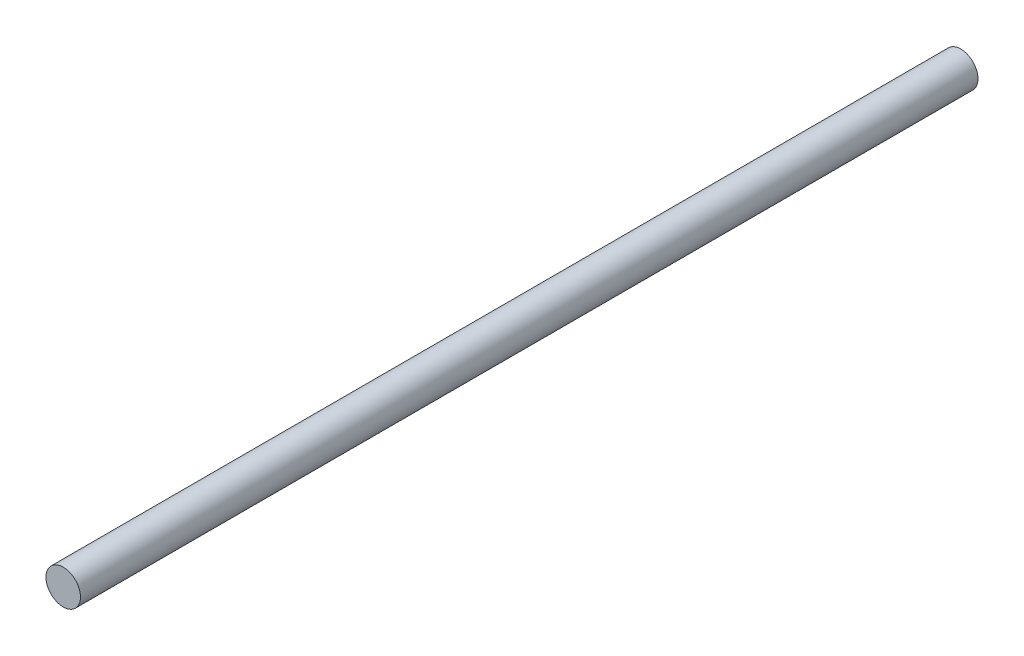
ISO-10303-21;
HEADER;
FILE_DESCRIPTION(('STEP AP214'),'2;1');
FILE_NAME('part.step','',(''),(''),'','','');
FILE_SCHEMA(('AUTOMOTIVE_DESIGN { 1 0 10303 214 1 1 1 1 }'));
ENDSEC;
DATA;
#1=APPLICATION_CONTEXT('core data for automotive mechanical design processes');
#2=APPLICATION_PROTOCOL_DEFINITION('international standard','automotive_design',2000,#1);
#3=PRODUCT_CONTEXT('',#1,'mechanical');
#4=PRODUCT('Part','Part','',(#3));
#5=PRODUCT_RELATED_PRODUCT_CATEGORY('part','',(#4));
#6=PRODUCT_DEFINITION_FORMATION('','',#4);
#7=PRODUCT_DEFINITION_CONTEXT('part definition',#1,'design');
#8=PRODUCT_DEFINITION('design','',#6,#7);
#9=PRODUCT_DEFINITION_SHAPE('','',#8);
#10=(LENGTH_UNIT() NAMED_UNIT(*) SI_UNIT(.MILLI.,.METRE.));
#11=(NAMED_UNIT(*) PLANE_ANGLE_UNIT() SI_UNIT($,.RADIAN.));
#12=(NAMED_UNIT(*) SI_UNIT($,.STERADIAN.) SOLID_ANGLE_UNIT());
#13=UNCERTAINTY_MEASURE_WITH_UNIT(LENGTH_MEASURE(1.E-05),#10,'distance_accuracy_value','');
#14=(GEOMETRIC_REPRESENTATION_CONTEXT(3) GLOBAL_UNCERTAINTY_ASSIGNED_CONTEXT((#13)) GLOBAL_UNIT_ASSIGNED_CONTEXT((#10,
#11,#12)) REPRESENTATION_CONTEXT('',''));
#15=CARTESIAN_POINT('',(0.,0.,0.));
#16=DIRECTION('',(0.,0.,1.));
#17=DIRECTION('',(1.,0.,0.));
#18=AXIS2_PLACEMENT_3D('',#15,#16,#17);
#19=CARTESIAN_POINT('',(0.,0.,247.65));
#20=DIRECTION('',(0.,0.,-1.));
#21=DIRECTION('',(-1.,0.,0.));
#22=AXIS2_PLACEMENT_3D('',#19,#20,#21);
#23=CYLINDRICAL_SURFACE('',#22,4.7625);
#24=CARTESIAN_POINT('',(0.,0.,247.65));
#25=DIRECTION('',(0.,0.,1.));
#26=DIRECTION('',(1.,0.,0.));
#27=AXIS2_PLACEMENT_3D('',#24,#25,#26);
#28=CIRCLE('',#27,4.7625);
#29=CARTESIAN_POINT('',(4.7625,0.,247.65));
#30=VERTEX_POINT('',#29);
#31=EDGE_CURVE('E10',#30,#30,#28,.T.);
#32=ORIENTED_EDGE('',*,*,#31,.F.);
#33=EDGE_LOOP('',(#32));
#34=FACE_BOUND('',#33,.T.);
#35=CARTESIAN_POINT('',(0.,0.,0.));
#36=DIRECTION('',(0.,0.,1.));
#37=DIRECTION('',(1.,0.,0.));
#38=AXIS2_PLACEMENT_3D('',#35,#36,#37);
#39=CIRCLE('',#38,4.7625);
#40=CARTESIAN_POINT('',(4.7625,0.,0.));
#41=VERTEX_POINT('',#40);
#42=EDGE_CURVE('E42',#41,#41,#39,.T.);
#43=ORIENTED_EDGE('',*,*,#42,.T.);
#44=EDGE_LOOP('',(#43));
#45=FACE_BOUND('',#44,.T.);
#46=ADVANCED_FACE('F39',(#34,#45),#23,.T.);
#47=CARTESIAN_POINT('',(0.,0.,247.65));
#48=DIRECTION('',(0.,0.,1.));
#49=DIRECTION('',(1.,0.,0.));
#50=AXIS2_PLACEMENT_3D('',#47,#48,#49);
#51=PLANE('',#50);
#52=ORIENTED_EDGE('',*,*,#31,.T.);
#53=EDGE_LOOP('',(#52));
#54=FACE_BOUND('',#53,.T.);
#55=ADVANCED_FACE('F56',(#54),#51,.T.);
#56=CARTESIAN_POINT('',(0.,0.,0.));
#57=DIRECTION('',(0.,0.,1.));
#58=DIRECTION('',(1.,0.,0.));
#59=AXIS2_PLACEMENT_3D('',#56,#57,#58);
#60=PLANE('',#59);
#61=ORIENTED_EDGE('',*,*,#42,.F.);
#62=EDGE_LOOP('',(#61));
#63=FACE_BOUND('',#62,.T.);
#64=ADVANCED_FACE('F54',(#63),#60,.F.);
#65=CLOSED_SHELL('',(#46,#55,#64));
#66=MANIFOLD_SOLID_BREP('B2',#65);
#67=ADVANCED_BREP_SHAPE_REPRESENTATION('',(#18,#66),#14);
#68=SHAPE_DEFINITION_REPRESENTATION(#9,#67);
ENDSEC;
END-ISO-10303-21;
